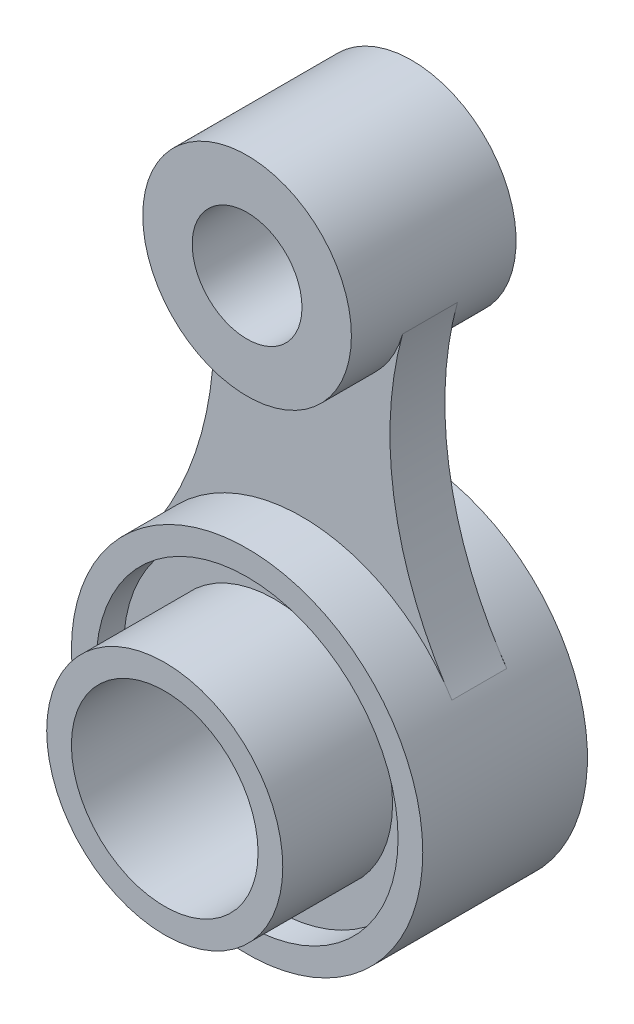
ISO-10303-21;
HEADER;
FILE_DESCRIPTION(('STEP AP214'),'2;1');
FILE_NAME('part.step','',(''),(''),'','','');
FILE_SCHEMA(('AUTOMOTIVE_DESIGN { 1 0 10303 214 1 1 1 1 }'));
ENDSEC;
DATA;
#1=APPLICATION_CONTEXT('core data for automotive mechanical design processes');
#2=APPLICATION_PROTOCOL_DEFINITION('international standard','automotive_design',2000,#1);
#3=PRODUCT_CONTEXT('',#1,'mechanical');
#4=PRODUCT('Part','Part','',(#3));
#5=PRODUCT_RELATED_PRODUCT_CATEGORY('part','',(#4));
#6=PRODUCT_DEFINITION_FORMATION('','',#4);
#7=PRODUCT_DEFINITION_CONTEXT('part definition',#1,'design');
#8=PRODUCT_DEFINITION('design','',#6,#7);
#9=PRODUCT_DEFINITION_SHAPE('','',#8);
#10=(LENGTH_UNIT() NAMED_UNIT(*) SI_UNIT(.MILLI.,.METRE.));
#11=(NAMED_UNIT(*) PLANE_ANGLE_UNIT() SI_UNIT($,.RADIAN.));
#12=(NAMED_UNIT(*) SI_UNIT($,.STERADIAN.) SOLID_ANGLE_UNIT());
#13=UNCERTAINTY_MEASURE_WITH_UNIT(LENGTH_MEASURE(1.E-05),#10,'distance_accuracy_value','');
#14=(GEOMETRIC_REPRESENTATION_CONTEXT(3) GLOBAL_UNCERTAINTY_ASSIGNED_CONTEXT((#13)) GLOBAL_UNIT_ASSIGNED_CONTEXT((#10,
#11,#12)) REPRESENTATION_CONTEXT('',''));
#15=CARTESIAN_POINT('',(0.,0.,0.));
#16=DIRECTION('',(0.,0.,1.));
#17=DIRECTION('',(1.,0.,0.));
#18=AXIS2_PLACEMENT_3D('',#15,#16,#17);
#19=CARTESIAN_POINT('',(0.,0.,10.));
#20=DIRECTION('',(0.,0.,1.));
#21=DIRECTION('',(1.,0.,0.));
#22=AXIS2_PLACEMENT_3D('',#19,#20,#21);
#23=PLANE('',#22);
#24=CARTESIAN_POINT('',(-80.0241332010139,-22.0258508445506,10.));
#25=DIRECTION('',(0.,0.,1.));
#26=DIRECTION('',(1.,0.,0.));
#27=AXIS2_PLACEMENT_3D('',#24,#25,#26);
#28=CIRCLE('',#27,64.);
#29=CARTESIAN_POINT('',(-18.3187774797502,-5.04206224152363,10.));
#30=VERTEX_POINT('',#29);
#31=CARTESIAN_POINT('',(-26.0353748344976,-56.3946443939598,10.));
#32=VERTEX_POINT('',#31);
#33=EDGE_CURVE('E113',#30,#32,#28,.F.);
#34=ORIENTED_EDGE('',*,*,#33,.T.);
#35=CARTESIAN_POINT('',(0.,-75.,10.));
#36=DIRECTION('',(0.,0.,1.));
#37=DIRECTION('',(1.,0.,0.));
#38=AXIS2_PLACEMENT_3D('',#35,#36,#37);
#39=CIRCLE('',#38,32.);
#40=CARTESIAN_POINT('',(26.0353748344976,-56.3946443939598,10.));
#41=VERTEX_POINT('',#40);
#42=EDGE_CURVE('E11',#32,#41,#39,.F.);
#43=ORIENTED_EDGE('',*,*,#42,.T.);
#44=CARTESIAN_POINT('',(80.0241332010139,-22.0258508445506,10.));
#45=DIRECTION('',(0.,0.,1.));
#46=DIRECTION('',(1.,0.,0.));
#47=AXIS2_PLACEMENT_3D('',#44,#45,#46);
#48=CIRCLE('',#47,64.);
#49=CARTESIAN_POINT('',(18.3187774797502,-5.04206224152362,10.));
#50=VERTEX_POINT('',#49);
#51=EDGE_CURVE('E104',#50,#41,#48,.T.);
#52=ORIENTED_EDGE('',*,*,#51,.F.);
#53=CARTESIAN_POINT('',(0.,0.,10.));
#54=DIRECTION('',(0.,0.,1.));
#55=DIRECTION('',(1.,0.,0.));
#56=AXIS2_PLACEMENT_3D('',#53,#54,#55);
#57=CIRCLE('',#56,19.);
#58=EDGE_CURVE('E131',#30,#50,#57,.T.);
#59=ORIENTED_EDGE('',*,*,#58,.F.);
#60=EDGE_LOOP('',(#34,#43,#52,#59));
#61=FACE_BOUND('',#60,.T.);
#62=ADVANCED_FACE('F37',(#61),#23,.T.);
#63=CARTESIAN_POINT('',(0.,0.,0.));
#64=DIRECTION('',(0.,0.,1.));
#65=DIRECTION('',(1.,0.,0.));
#66=AXIS2_PLACEMENT_3D('',#63,#64,#65);
#67=PLANE('',#66);
#68=CARTESIAN_POINT('',(0.,-75.,0.));
#69=DIRECTION('',(0.,0.,-1.));
#70=DIRECTION('',(-1.,0.,0.));
#71=AXIS2_PLACEMENT_3D('',#68,#69,#70);
#72=CIRCLE('',#71,32.);
#73=CARTESIAN_POINT('',(-26.0353748344974,-56.3946443939595,0.));
#74=VERTEX_POINT('',#73);
#75=CARTESIAN_POINT('',(26.0353748344974,-56.3946443939595,0.));
#76=VERTEX_POINT('',#75);
#77=EDGE_CURVE('E59',#74,#76,#72,.T.);
#78=ORIENTED_EDGE('',*,*,#77,.F.);
#79=CARTESIAN_POINT('',(-80.0241332010139,-22.0258508445506,0.));
#80=DIRECTION('',(0.,0.,1.));
#81=DIRECTION('',(1.,0.,0.));
#82=AXIS2_PLACEMENT_3D('',#79,#80,#81);
#83=CIRCLE('',#82,64.);
#84=CARTESIAN_POINT('',(-18.3187774797502,-5.04206224152363,0.));
#85=VERTEX_POINT('',#84);
#86=EDGE_CURVE('E105',#85,#74,#83,.F.);
#87=ORIENTED_EDGE('',*,*,#86,.F.);
#88=CARTESIAN_POINT('',(0.,0.,0.));
#89=DIRECTION('',(0.,0.,-1.));
#90=DIRECTION('',(-1.,0.,0.));
#91=AXIS2_PLACEMENT_3D('',#88,#89,#90);
#92=CIRCLE('',#91,19.);
#93=CARTESIAN_POINT('',(18.3187774797502,-5.04206224152362,0.));
#94=VERTEX_POINT('',#93);
#95=EDGE_CURVE('E130',#94,#85,#92,.T.);
#96=ORIENTED_EDGE('',*,*,#95,.F.);
#97=CARTESIAN_POINT('',(80.0241332010139,-22.0258508445506,0.));
#98=DIRECTION('',(0.,0.,1.));
#99=DIRECTION('',(1.,0.,0.));
#100=AXIS2_PLACEMENT_3D('',#97,#98,#99);
#101=CIRCLE('',#100,64.);
#102=EDGE_CURVE('E133',#94,#76,#101,.T.);
#103=ORIENTED_EDGE('',*,*,#102,.T.);
#104=EDGE_LOOP('',(#78,#87,#96,#103));
#105=FACE_BOUND('',#104,.T.);
#106=ADVANCED_FACE('F132',(#105),#67,.F.);
#107=CARTESIAN_POINT('',(80.0241332010139,-22.0258508445506,10.));
#108=DIRECTION('',(0.,0.,-1.));
#109=DIRECTION('',(-1.,0.,0.));
#110=AXIS2_PLACEMENT_3D('',#107,#108,#109);
#111=CYLINDRICAL_SURFACE('',#110,64.);
#112=ORIENTED_EDGE('',*,*,#102,.F.);
#113=DIRECTION('',(0.,0.,-1.));
#114=VECTOR('',#113,1.);
#115=CARTESIAN_POINT('',(18.3187774797502,-5.04206224152362,10.));
#116=LINE('',#115,#114);
#117=EDGE_CURVE('E45',#50,#94,#116,.T.);
#118=ORIENTED_EDGE('',*,*,#117,.F.);
#119=ORIENTED_EDGE('',*,*,#51,.T.);
#120=CARTESIAN_POINT('',(27.297024290787,-58.3005250121991,10.));
#121=VERTEX_POINT('',#120);
#122=EDGE_CURVE('E93',#41,#121,#48,.T.);
#123=ORIENTED_EDGE('',*,*,#122,.T.);
#124=DIRECTION('',(0.,0.,-1.));
#125=VECTOR('',#124,1.);
#126=CARTESIAN_POINT('',(27.297024290787,-58.3005250121991,10.));
#127=LINE('',#126,#125);
#128=CARTESIAN_POINT('',(27.297024290787,-58.3005250121991,0.));
#129=VERTEX_POINT('',#128);
#130=EDGE_CURVE('E101',#121,#129,#127,.T.);
#131=ORIENTED_EDGE('',*,*,#130,.T.);
#132=CARTESIAN_POINT('',(80.0241332010139,-22.0258508445506,0.));
#133=DIRECTION('',(0.,0.,-1.));
#134=DIRECTION('',(-1.,0.,0.));
#135=AXIS2_PLACEMENT_3D('',#132,#133,#134);
#136=CIRCLE('',#135,64.);
#137=EDGE_CURVE('E52',#129,#76,#136,.T.);
#138=ORIENTED_EDGE('',*,*,#137,.T.);
#139=EDGE_LOOP('',(#112,#118,#119,#123,#131,#138));
#140=FACE_BOUND('',#139,.T.);
#141=ADVANCED_FACE('F39',(#140),#111,.F.);
#142=CARTESIAN_POINT('',(0.,0.,10.));
#143=DIRECTION('',(0.,0.,-1.));
#144=DIRECTION('',(-1.,0.,0.));
#145=AXIS2_PLACEMENT_3D('',#142,#143,#144);
#146=CYLINDRICAL_SURFACE('',#145,19.);
#147=ORIENTED_EDGE('',*,*,#117,.T.);
#148=ORIENTED_EDGE('',*,*,#95,.T.);
#149=DIRECTION('',(0.,0.,-1.));
#150=VECTOR('',#149,1.);
#151=CARTESIAN_POINT('',(-18.3187774797502,-5.04206224152363,10.));
#152=LINE('',#151,#150);
#153=EDGE_CURVE('E115',#30,#85,#152,.T.);
#154=ORIENTED_EDGE('',*,*,#153,.F.);
#155=ORIENTED_EDGE('',*,*,#58,.T.);
#156=EDGE_LOOP('',(#147,#148,#154,#155));
#157=FACE_BOUND('',#156,.T.);
#158=CARTESIAN_POINT('',(0.,0.,-10.));
#159=DIRECTION('',(0.,0.,-1.));
#160=DIRECTION('',(-1.,0.,0.));
#161=AXIS2_PLACEMENT_3D('',#158,#159,#160);
#162=CIRCLE('',#161,19.);
#163=CARTESIAN_POINT('',(-19.,0.,-10.));
#164=VERTEX_POINT('',#163);
#165=EDGE_CURVE('E134',#164,#164,#162,.T.);
#166=ORIENTED_EDGE('',*,*,#165,.F.);
#167=EDGE_LOOP('',(#166));
#168=FACE_BOUND('',#167,.T.);
#169=CARTESIAN_POINT('',(0.,0.,20.));
#170=DIRECTION('',(0.,0.,1.));
#171=DIRECTION('',(1.,0.,0.));
#172=AXIS2_PLACEMENT_3D('',#169,#170,#171);
#173=CIRCLE('',#172,19.);
#174=CARTESIAN_POINT('',(19.,0.,20.));
#175=VERTEX_POINT('',#174);
#176=EDGE_CURVE('E156',#175,#175,#173,.T.);
#177=ORIENTED_EDGE('',*,*,#176,.F.);
#178=EDGE_LOOP('',(#177));
#179=FACE_BOUND('',#178,.T.);
#180=ADVANCED_FACE('F127',(#157,#168,#179),#146,.T.);
#181=CARTESIAN_POINT('',(-80.0241332010139,-22.0258508445506,10.));
#182=DIRECTION('',(0.,0.,-1.));
#183=DIRECTION('',(-1.,0.,0.));
#184=AXIS2_PLACEMENT_3D('',#181,#182,#183);
#185=CYLINDRICAL_SURFACE('',#184,64.);
#186=ORIENTED_EDGE('',*,*,#86,.T.);
#187=CARTESIAN_POINT('',(-80.0241332010139,-22.0258508445506,0.));
#188=DIRECTION('',(0.,0.,-1.));
#189=DIRECTION('',(-1.,0.,0.));
#190=AXIS2_PLACEMENT_3D('',#187,#188,#189);
#191=CIRCLE('',#190,64.);
#192=CARTESIAN_POINT('',(-27.2970242907871,-58.3005250121994,0.));
#193=VERTEX_POINT('',#192);
#194=EDGE_CURVE('E138',#193,#74,#191,.F.);
#195=ORIENTED_EDGE('',*,*,#194,.F.);
#196=DIRECTION('',(0.,0.,-1.));
#197=VECTOR('',#196,1.);
#198=CARTESIAN_POINT('',(-27.2970242907871,-58.3005250121994,10.));
#199=LINE('',#198,#197);
#200=CARTESIAN_POINT('',(-27.2970242907871,-58.3005250121994,10.));
#201=VERTEX_POINT('',#200);
#202=EDGE_CURVE('E112',#201,#193,#199,.T.);
#203=ORIENTED_EDGE('',*,*,#202,.F.);
#204=EDGE_CURVE('E118',#32,#201,#28,.F.);
#205=ORIENTED_EDGE('',*,*,#204,.F.);
#206=ORIENTED_EDGE('',*,*,#33,.F.);
#207=ORIENTED_EDGE('',*,*,#153,.T.);
#208=EDGE_LOOP('',(#186,#195,#203,#205,#206,#207));
#209=FACE_BOUND('',#208,.T.);
#210=ADVANCED_FACE('F143',(#209),#185,.F.);
#211=CARTESIAN_POINT('',(0.,-75.,10.));
#212=DIRECTION('',(0.,0.,-1.));
#213=DIRECTION('',(-1.,0.,0.));
#214=AXIS2_PLACEMENT_3D('',#211,#212,#213);
#215=CYLINDRICAL_SURFACE('',#214,32.);
#216=ORIENTED_EDGE('',*,*,#202,.T.);
#217=EDGE_CURVE('E150',#193,#74,#72,.T.);
#218=ORIENTED_EDGE('',*,*,#217,.T.);
#219=ORIENTED_EDGE('',*,*,#77,.T.);
#220=EDGE_CURVE('E111',#76,#129,#72,.T.);
#221=ORIENTED_EDGE('',*,*,#220,.T.);
#222=ORIENTED_EDGE('',*,*,#130,.F.);
#223=CARTESIAN_POINT('',(0.,-75.,10.));
#224=DIRECTION('',(0.,0.,1.));
#225=DIRECTION('',(1.,0.,0.));
#226=AXIS2_PLACEMENT_3D('',#223,#224,#225);
#227=CIRCLE('',#226,32.);
#228=EDGE_CURVE('E90',#121,#41,#227,.T.);
#229=ORIENTED_EDGE('',*,*,#228,.T.);
#230=ORIENTED_EDGE('',*,*,#42,.F.);
#231=EDGE_CURVE('E98',#32,#201,#227,.T.);
#232=ORIENTED_EDGE('',*,*,#231,.T.);
#233=EDGE_LOOP('',(#216,#218,#219,#221,#222,#229,#230,#232));
#234=FACE_BOUND('',#233,.T.);
#235=CARTESIAN_POINT('',(0.,-75.,-10.));
#236=DIRECTION('',(0.,0.,-1.));
#237=DIRECTION('',(-1.,0.,0.));
#238=AXIS2_PLACEMENT_3D('',#235,#236,#237);
#239=CIRCLE('',#238,32.);
#240=CARTESIAN_POINT('',(-32.,-75.,-10.));
#241=VERTEX_POINT('',#240);
#242=EDGE_CURVE('E151',#241,#241,#239,.T.);
#243=ORIENTED_EDGE('',*,*,#242,.F.);
#244=EDGE_LOOP('',(#243));
#245=FACE_BOUND('',#244,.T.);
#246=CARTESIAN_POINT('',(0.,-75.,20.));
#247=DIRECTION('',(0.,0.,1.));
#248=DIRECTION('',(1.,0.,0.));
#249=AXIS2_PLACEMENT_3D('',#246,#247,#248);
#250=CIRCLE('',#249,32.);
#251=CARTESIAN_POINT('',(32.,-75.,20.));
#252=VERTEX_POINT('',#251);
#253=EDGE_CURVE('E97',#252,#252,#250,.T.);
#254=ORIENTED_EDGE('',*,*,#253,.F.);
#255=EDGE_LOOP('',(#254));
#256=FACE_BOUND('',#255,.T.);
#257=ADVANCED_FACE('F108',(#234,#245,#256),#215,.T.);
#258=CARTESIAN_POINT('',(0.,0.,-10.));
#259=DIRECTION('',(0.,0.,-1.));
#260=DIRECTION('',(-1.,0.,0.));
#261=AXIS2_PLACEMENT_3D('',#258,#259,#260);
#262=PLANE('',#261);
#263=CARTESIAN_POINT('',(0.,0.,-10.));
#264=DIRECTION('',(0.,0.,-1.));
#265=DIRECTION('',(-1.,0.,0.));
#266=AXIS2_PLACEMENT_3D('',#263,#264,#265);
#267=CIRCLE('',#266,10.);
#268=CARTESIAN_POINT('',(10.,0.,-10.));
#269=VERTEX_POINT('',#268);
#270=EDGE_CURVE('E181',#269,#269,#267,.T.);
#271=ORIENTED_EDGE('',*,*,#270,.F.);
#272=EDGE_LOOP('',(#271));
#273=FACE_BOUND('',#272,.T.);
#274=ORIENTED_EDGE('',*,*,#165,.T.);
#275=EDGE_LOOP('',(#274));
#276=FACE_BOUND('',#275,.T.);
#277=ADVANCED_FACE('F216',(#273,#276),#262,.T.);
#278=CARTESIAN_POINT('',(0.,-75.,0.));
#279=DIRECTION('',(0.,0.,-1.));
#280=DIRECTION('',(-1.,0.,0.));
#281=AXIS2_PLACEMENT_3D('',#278,#279,#280);
#282=PLANE('',#281);
#283=ORIENTED_EDGE('',*,*,#217,.F.);
#284=ORIENTED_EDGE('',*,*,#194,.T.);
#285=EDGE_LOOP('',(#283,#284));
#286=FACE_BOUND('',#285,.T.);
#287=ADVANCED_FACE('F149',(#286),#282,.F.);
#288=CARTESIAN_POINT('',(0.,-75.,-10.));
#289=DIRECTION('',(0.,0.,-1.));
#290=DIRECTION('',(-1.,0.,0.));
#291=AXIS2_PLACEMENT_3D('',#288,#289,#290);
#292=PLANE('',#291);
#293=CARTESIAN_POINT('',(0.,-75.,-9.99999999999999));
#294=DIRECTION('',(0.,0.,1.));
#295=DIRECTION('',(1.,0.,0.));
#296=AXIS2_PLACEMENT_3D('',#293,#294,#295);
#297=CIRCLE('',#296,17.);
#298=CARTESIAN_POINT('',(17.,-75.,-10.));
#299=VERTEX_POINT('',#298);
#300=EDGE_CURVE('E175',#299,#299,#297,.T.);
#301=ORIENTED_EDGE('',*,*,#300,.T.);
#302=EDGE_LOOP('',(#301));
#303=FACE_BOUND('',#302,.T.);
#304=ORIENTED_EDGE('',*,*,#242,.T.);
#305=EDGE_LOOP('',(#304));
#306=FACE_BOUND('',#305,.T.);
#307=ADVANCED_FACE('F204',(#303,#306),#292,.T.);
#308=ORIENTED_EDGE('',*,*,#137,.F.);
#309=ORIENTED_EDGE('',*,*,#220,.F.);
#310=EDGE_LOOP('',(#308,#309));
#311=FACE_BOUND('',#310,.T.);
#312=ADVANCED_FACE('F195',(#311),#282,.F.);
#313=CARTESIAN_POINT('',(0.,0.,20.));
#314=DIRECTION('',(0.,0.,1.));
#315=DIRECTION('',(1.,0.,0.));
#316=AXIS2_PLACEMENT_3D('',#313,#314,#315);
#317=PLANE('',#316);
#318=CARTESIAN_POINT('',(0.,0.,20.));
#319=DIRECTION('',(0.,0.,1.));
#320=DIRECTION('',(1.,0.,0.));
#321=AXIS2_PLACEMENT_3D('',#318,#319,#320);
#322=CIRCLE('',#321,10.);
#323=CARTESIAN_POINT('',(10.,0.,20.));
#324=VERTEX_POINT('',#323);
#325=EDGE_CURVE('E186',#324,#324,#322,.T.);
#326=ORIENTED_EDGE('',*,*,#325,.F.);
#327=EDGE_LOOP('',(#326));
#328=FACE_BOUND('',#327,.T.);
#329=ORIENTED_EDGE('',*,*,#176,.T.);
#330=EDGE_LOOP('',(#329));
#331=FACE_BOUND('',#330,.T.);
#332=ADVANCED_FACE('F192',(#328,#331),#317,.T.);
#333=CARTESIAN_POINT('',(0.,-75.,10.));
#334=DIRECTION('',(0.,0.,1.));
#335=DIRECTION('',(1.,0.,0.));
#336=AXIS2_PLACEMENT_3D('',#333,#334,#335);
#337=PLANE('',#336);
#338=ORIENTED_EDGE('',*,*,#231,.F.);
#339=ORIENTED_EDGE('',*,*,#204,.T.);
#340=EDGE_LOOP('',(#338,#339));
#341=FACE_BOUND('',#340,.T.);
#342=ADVANCED_FACE('F194',(#341),#337,.F.);
#343=CARTESIAN_POINT('',(0.,-75.,20.));
#344=DIRECTION('',(0.,0.,1.));
#345=DIRECTION('',(1.,0.,0.));
#346=AXIS2_PLACEMENT_3D('',#343,#344,#345);
#347=PLANE('',#346);
#348=CARTESIAN_POINT('',(0.,-75.,20.));
#349=DIRECTION('',(0.,0.,1.));
#350=DIRECTION('',(1.,0.,0.));
#351=AXIS2_PLACEMENT_3D('',#348,#349,#350);
#352=CIRCLE('',#351,27.5);
#353=CARTESIAN_POINT('',(27.5,-75.,20.));
#354=VERTEX_POINT('',#353);
#355=EDGE_CURVE('E165',#354,#354,#352,.T.);
#356=ORIENTED_EDGE('',*,*,#355,.F.);
#357=EDGE_LOOP('',(#356));
#358=FACE_BOUND('',#357,.T.);
#359=ORIENTED_EDGE('',*,*,#253,.T.);
#360=EDGE_LOOP('',(#359));
#361=FACE_BOUND('',#360,.T.);
#362=ADVANCED_FACE('F201',(#358,#361),#347,.T.);
#363=ORIENTED_EDGE('',*,*,#122,.F.);
#364=ORIENTED_EDGE('',*,*,#228,.F.);
#365=EDGE_LOOP('',(#363,#364));
#366=FACE_BOUND('',#365,.T.);
#367=ADVANCED_FACE('F92',(#366),#337,.F.);
#368=CARTESIAN_POINT('',(0.,-75.,15.));
#369=DIRECTION('',(0.,0.,1.));
#370=DIRECTION('',(1.,0.,0.));
#371=AXIS2_PLACEMENT_3D('',#368,#369,#370);
#372=CYLINDRICAL_SURFACE('',#371,27.5);
#373=CARTESIAN_POINT('',(0.,-75.,15.));
#374=DIRECTION('',(0.,0.,1.));
#375=DIRECTION('',(1.,0.,0.));
#376=AXIS2_PLACEMENT_3D('',#373,#374,#375);
#377=CIRCLE('',#376,27.5);
#378=CARTESIAN_POINT('',(27.5,-75.,15.));
#379=VERTEX_POINT('',#378);
#380=EDGE_CURVE('E168',#379,#379,#377,.T.);
#381=ORIENTED_EDGE('',*,*,#380,.F.);
#382=EDGE_LOOP('',(#381));
#383=FACE_BOUND('',#382,.T.);
#384=ORIENTED_EDGE('',*,*,#355,.T.);
#385=EDGE_LOOP('',(#384));
#386=FACE_BOUND('',#385,.T.);
#387=ADVANCED_FACE('F297',(#383,#386),#372,.F.);
#388=CARTESIAN_POINT('',(0.,-75.,15.));
#389=DIRECTION('',(0.,0.,1.));
#390=DIRECTION('',(1.,0.,0.));
#391=AXIS2_PLACEMENT_3D('',#388,#389,#390);
#392=PLANE('',#391);
#393=CARTESIAN_POINT('',(0.,-75.,15.));
#394=DIRECTION('',(0.,0.,1.));
#395=DIRECTION('',(1.,0.,0.));
#396=AXIS2_PLACEMENT_3D('',#393,#394,#395);
#397=CIRCLE('',#396,21.5);
#398=CARTESIAN_POINT('',(21.5,-75.,15.));
#399=VERTEX_POINT('',#398);
#400=EDGE_CURVE('E172',#399,#399,#397,.T.);
#401=ORIENTED_EDGE('',*,*,#400,.F.);
#402=EDGE_LOOP('',(#401));
#403=FACE_BOUND('',#402,.T.);
#404=ORIENTED_EDGE('',*,*,#380,.T.);
#405=EDGE_LOOP('',(#404));
#406=FACE_BOUND('',#405,.T.);
#407=ADVANCED_FACE('F264',(#403,#406),#392,.T.);
#408=CARTESIAN_POINT('',(0.,-75.,35.));
#409=DIRECTION('',(0.,0.,-1.));
#410=DIRECTION('',(-1.,0.,0.));
#411=AXIS2_PLACEMENT_3D('',#408,#409,#410);
#412=CYLINDRICAL_SURFACE('',#411,21.5);
#413=CARTESIAN_POINT('',(0.,-75.,35.));
#414=DIRECTION('',(0.,0.,1.));
#415=DIRECTION('',(1.,0.,0.));
#416=AXIS2_PLACEMENT_3D('',#413,#414,#415);
#417=CIRCLE('',#416,21.5);
#418=CARTESIAN_POINT('',(21.5,-75.,35.));
#419=VERTEX_POINT('',#418);
#420=EDGE_CURVE('E169',#419,#419,#417,.T.);
#421=ORIENTED_EDGE('',*,*,#420,.F.);
#422=EDGE_LOOP('',(#421));
#423=FACE_BOUND('',#422,.T.);
#424=ORIENTED_EDGE('',*,*,#400,.T.);
#425=EDGE_LOOP('',(#424));
#426=FACE_BOUND('',#425,.T.);
#427=ADVANCED_FACE('F258',(#423,#426),#412,.T.);
#428=CARTESIAN_POINT('',(0.,-75.,35.));
#429=DIRECTION('',(0.,0.,1.));
#430=DIRECTION('',(1.,0.,0.));
#431=AXIS2_PLACEMENT_3D('',#428,#429,#430);
#432=PLANE('',#431);
#433=CARTESIAN_POINT('',(0.,-75.,35.));
#434=DIRECTION('',(0.,0.,1.));
#435=DIRECTION('',(1.,0.,0.));
#436=AXIS2_PLACEMENT_3D('',#433,#434,#435);
#437=CIRCLE('',#436,17.);
#438=CARTESIAN_POINT('',(17.,-75.,35.));
#439=VERTEX_POINT('',#438);
#440=EDGE_CURVE('E178',#439,#439,#437,.T.);
#441=ORIENTED_EDGE('',*,*,#440,.F.);
#442=EDGE_LOOP('',(#441));
#443=FACE_BOUND('',#442,.T.);
#444=ORIENTED_EDGE('',*,*,#420,.T.);
#445=EDGE_LOOP('',(#444));
#446=FACE_BOUND('',#445,.T.);
#447=ADVANCED_FACE('F263',(#443,#446),#432,.T.);
#448=CARTESIAN_POINT('',(0.,-75.,-9.99999999999999));
#449=DIRECTION('',(0.,0.,1.));
#450=DIRECTION('',(1.,0.,0.));
#451=AXIS2_PLACEMENT_3D('',#448,#449,#450);
#452=CYLINDRICAL_SURFACE('',#451,17.);
#453=CARTESIAN_POINT('',(17.,-75.,-10.));
#454=CARTESIAN_POINT('',(17.,-75.,-9.53125));
#455=CARTESIAN_POINT('',(17.,-75.,-9.0625));
#456=CARTESIAN_POINT('',(17.,-75.,-8.12499999999999));
#457=CARTESIAN_POINT('',(17.,-75.,-7.65625));
#458=CARTESIAN_POINT('',(17.,-75.,-6.71875));
#459=CARTESIAN_POINT('',(17.,-75.,-6.25));
#460=CARTESIAN_POINT('',(17.,-75.,-5.3125));
#461=CARTESIAN_POINT('',(17.,-75.,-4.84375));
#462=CARTESIAN_POINT('',(17.,-75.,-3.90625));
#463=CARTESIAN_POINT('',(17.,-75.,-3.4375));
#464=CARTESIAN_POINT('',(17.,-75.,-2.5));
#465=CARTESIAN_POINT('',(17.,-75.,-2.03125));
#466=CARTESIAN_POINT('',(17.,-75.,-1.09375));
#467=CARTESIAN_POINT('',(17.,-75.,-0.624999999999998));
#468=CARTESIAN_POINT('',(17.,-75.,0.312500000000001));
#469=CARTESIAN_POINT('',(17.,-75.,0.781250000000001));
#470=CARTESIAN_POINT('',(17.,-75.,1.71875));
#471=CARTESIAN_POINT('',(17.,-75.,2.1875));
#472=CARTESIAN_POINT('',(17.,-75.,3.125));
#473=CARTESIAN_POINT('',(17.,-75.,3.59375));
#474=CARTESIAN_POINT('',(17.,-75.,4.53125));
#475=CARTESIAN_POINT('',(17.,-75.,5.));
#476=CARTESIAN_POINT('',(17.,-75.,5.9375));
#477=CARTESIAN_POINT('',(17.,-75.,6.40625));
#478=CARTESIAN_POINT('',(17.,-75.,7.34375));
#479=CARTESIAN_POINT('',(17.,-75.,7.8125));
#480=CARTESIAN_POINT('',(17.,-75.,8.75));
#481=CARTESIAN_POINT('',(17.,-75.,9.21875));
#482=CARTESIAN_POINT('',(17.,-75.,10.15625));
#483=CARTESIAN_POINT('',(17.,-75.,10.625));
#484=CARTESIAN_POINT('',(17.,-75.,11.5625));
#485=CARTESIAN_POINT('',(17.,-75.,12.03125));
#486=CARTESIAN_POINT('',(17.,-75.,12.96875));
#487=CARTESIAN_POINT('',(17.,-75.,13.4375));
#488=CARTESIAN_POINT('',(17.,-75.,14.375));
#489=CARTESIAN_POINT('',(17.,-75.,14.84375));
#490=CARTESIAN_POINT('',(17.,-75.,15.78125));
#491=CARTESIAN_POINT('',(17.,-75.,16.25));
#492=CARTESIAN_POINT('',(17.,-75.,17.1875));
#493=CARTESIAN_POINT('',(17.,-75.,17.65625));
#494=CARTESIAN_POINT('',(17.,-75.,18.59375));
#495=CARTESIAN_POINT('',(17.,-75.,19.0625));
#496=CARTESIAN_POINT('',(17.,-75.,20.));
#497=CARTESIAN_POINT('',(17.,-75.,20.46875));
#498=CARTESIAN_POINT('',(17.,-75.,21.40625));
#499=CARTESIAN_POINT('',(17.,-75.,21.875));
#500=CARTESIAN_POINT('',(17.,-75.,22.8125));
#501=CARTESIAN_POINT('',(17.,-75.,23.28125));
#502=CARTESIAN_POINT('',(17.,-75.,24.21875));
#503=CARTESIAN_POINT('',(17.,-75.,24.6875));
#504=CARTESIAN_POINT('',(17.,-75.,25.625));
#505=CARTESIAN_POINT('',(17.,-75.,26.09375));
#506=CARTESIAN_POINT('',(17.,-75.,27.03125));
#507=CARTESIAN_POINT('',(17.,-75.,27.5));
#508=CARTESIAN_POINT('',(17.,-75.,28.4375));
#509=CARTESIAN_POINT('',(17.,-75.,28.90625));
#510=CARTESIAN_POINT('',(17.,-75.,29.84375));
#511=CARTESIAN_POINT('',(17.,-75.,30.3125));
#512=CARTESIAN_POINT('',(17.,-75.,31.25));
#513=CARTESIAN_POINT('',(17.,-75.,31.71875));
#514=CARTESIAN_POINT('',(17.,-75.,32.65625));
#515=CARTESIAN_POINT('',(17.,-75.,33.125));
#516=CARTESIAN_POINT('',(17.,-75.,34.0625));
#517=CARTESIAN_POINT('',(17.,-75.,34.53125));
#518=CARTESIAN_POINT('',(17.,-75.,35.));
#519=B_SPLINE_CURVE_WITH_KNOTS('',3,(#453,#454,#455,#456,#457,#458,#459,#460,#461,#462,#463,
#464,#465,#466,#467,#468,#469,#470,#471,#472,#473,#474,#475,#476,#477,#478,#479,#480,#481,#482,
#483,#484,#485,#486,#487,#488,#489,#490,#491,#492,#493,#494,#495,#496,#497,#498,#499,#500,#501,
#502,#503,#504,#505,#506,#507,#508,#509,#510,#511,#512,#513,#514,#515,#516,#517,#518),
.UNSPECIFIED.,.F.,.F.,(4,2,2,2,2,2,2,2,2,2,2,2,2,2,2,2,2,2,2,2,2,2,2,2,2,2,2,2,2,2,2,2,4),(0.,
1.40625,2.8125,4.21875,5.625,7.03125,8.4375,9.84375,11.25,12.65625,14.0625,15.46875,16.875,
18.28125,19.6875,21.09375,22.5,23.90625,25.3125,26.71875,28.125,29.53125,30.9375,32.34375,33.75,
35.15625,36.5625,37.96875,39.375,40.78125,42.1875,43.59375,45.),.UNSPECIFIED.);
#520=EDGE_CURVE('BSEAM277',#299,#439,#519,.T.);
#521=ORIENTED_EDGE('',*,*,#300,.F.);
#522=ORIENTED_EDGE('',*,*,#440,.T.);
#523=ORIENTED_EDGE('',*,*,#520,.T.);
#524=ORIENTED_EDGE('',*,*,#520,.F.);
#525=EDGE_LOOP('',(#521,#523,#522,#524));
#526=FACE_BOUND('',#525,.T.);
#527=ADVANCED_FACE('F277',(#526),#452,.F.);
#528=CARTESIAN_POINT('',(0.,0.,-25.));
#529=DIRECTION('',(0.,0.,1.));
#530=DIRECTION('',(1.,0.,0.));
#531=AXIS2_PLACEMENT_3D('',#528,#529,#530);
#532=CYLINDRICAL_SURFACE('',#531,10.);
#533=CARTESIAN_POINT('',(10.,0.,-10.));
#534=CARTESIAN_POINT('',(10.,0.,-9.6875));
#535=CARTESIAN_POINT('',(10.,0.,-9.375));
#536=CARTESIAN_POINT('',(10.,0.,-8.75));
#537=CARTESIAN_POINT('',(10.,0.,-8.4375));
#538=CARTESIAN_POINT('',(10.,0.,-7.8125));
#539=CARTESIAN_POINT('',(10.,0.,-7.5));
#540=CARTESIAN_POINT('',(10.,0.,-6.875));
#541=CARTESIAN_POINT('',(10.,0.,-6.5625));
#542=CARTESIAN_POINT('',(10.,0.,-5.9375));
#543=CARTESIAN_POINT('',(10.,0.,-5.625));
#544=CARTESIAN_POINT('',(10.,0.,-5.));
#545=CARTESIAN_POINT('',(10.,0.,-4.6875));
#546=CARTESIAN_POINT('',(10.,0.,-4.0625));
#547=CARTESIAN_POINT('',(10.,0.,-3.75));
#548=CARTESIAN_POINT('',(10.,0.,-3.125));
#549=CARTESIAN_POINT('',(10.,0.,-2.8125));
#550=CARTESIAN_POINT('',(10.,0.,-2.1875));
#551=CARTESIAN_POINT('',(10.,0.,-1.875));
#552=CARTESIAN_POINT('',(10.,0.,-1.25));
#553=CARTESIAN_POINT('',(10.,0.,-0.937500000000001));
#554=CARTESIAN_POINT('',(10.,0.,-0.312500000000001));
#555=CARTESIAN_POINT('',(10.,0.,0.));
#556=CARTESIAN_POINT('',(10.,0.,0.624999999999997));
#557=CARTESIAN_POINT('',(10.,0.,0.937499999999997));
#558=CARTESIAN_POINT('',(10.,0.,1.5625));
#559=CARTESIAN_POINT('',(10.,0.,1.875));
#560=CARTESIAN_POINT('',(10.,0.,2.5));
#561=CARTESIAN_POINT('',(10.,0.,2.8125));
#562=CARTESIAN_POINT('',(10.,0.,3.4375));
#563=CARTESIAN_POINT('',(10.,0.,3.75));
#564=CARTESIAN_POINT('',(10.,0.,4.375));
#565=CARTESIAN_POINT('',(10.,0.,4.6875));
#566=CARTESIAN_POINT('',(10.,0.,5.3125));
#567=CARTESIAN_POINT('',(10.,0.,5.625));
#568=CARTESIAN_POINT('',(10.,0.,6.25));
#569=CARTESIAN_POINT('',(10.,0.,6.5625));
#570=CARTESIAN_POINT('',(10.,0.,7.18749999999999));
#571=CARTESIAN_POINT('',(10.,0.,7.49999999999999));
#572=CARTESIAN_POINT('',(10.,0.,8.12499999999999));
#573=CARTESIAN_POINT('',(10.,0.,8.43749999999999));
#574=CARTESIAN_POINT('',(10.,0.,9.0625));
#575=CARTESIAN_POINT('',(10.,0.,9.37499999999999));
#576=CARTESIAN_POINT('',(10.,0.,9.99999999999999));
#577=CARTESIAN_POINT('',(10.,0.,10.3125));
#578=CARTESIAN_POINT('',(10.,0.,10.9375));
#579=CARTESIAN_POINT('',(10.,0.,11.25));
#580=CARTESIAN_POINT('',(10.,0.,11.875));
#581=CARTESIAN_POINT('',(10.,0.,12.1875));
#582=CARTESIAN_POINT('',(10.,0.,12.8125));
#583=CARTESIAN_POINT('',(10.,0.,13.125));
#584=CARTESIAN_POINT('',(10.,0.,13.75));
#585=CARTESIAN_POINT('',(10.,0.,14.0625));
#586=CARTESIAN_POINT('',(10.,0.,14.6875));
#587=CARTESIAN_POINT('',(10.,0.,15.));
#588=CARTESIAN_POINT('',(10.,0.,15.625));
#589=CARTESIAN_POINT('',(10.,0.,15.9375));
#590=CARTESIAN_POINT('',(10.,0.,16.5625));
#591=CARTESIAN_POINT('',(10.,0.,16.875));
#592=CARTESIAN_POINT('',(10.,0.,17.5));
#593=CARTESIAN_POINT('',(10.,0.,17.8125));
#594=CARTESIAN_POINT('',(10.,0.,18.4375));
#595=CARTESIAN_POINT('',(10.,0.,18.75));
#596=CARTESIAN_POINT('',(10.,0.,19.375));
#597=CARTESIAN_POINT('',(10.,0.,19.6875));
#598=CARTESIAN_POINT('',(10.,0.,20.));
#599=B_SPLINE_CURVE_WITH_KNOTS('',3,(#533,#534,#535,#536,#537,#538,#539,#540,#541,#542,#543,
#544,#545,#546,#547,#548,#549,#550,#551,#552,#553,#554,#555,#556,#557,#558,#559,#560,#561,#562,
#563,#564,#565,#566,#567,#568,#569,#570,#571,#572,#573,#574,#575,#576,#577,#578,#579,#580,#581,
#582,#583,#584,#585,#586,#587,#588,#589,#590,#591,#592,#593,#594,#595,#596,#597,#598),
.UNSPECIFIED.,.F.,.F.,(4,2,2,2,2,2,2,2,2,2,2,2,2,2,2,2,2,2,2,2,2,2,2,2,2,2,2,2,2,2,2,2,4),(0.,
0.937499999999999,1.875,2.8125,3.75,4.6875,5.625,6.5625,7.5,8.4375,9.375,10.3125,11.25,12.1875,
13.125,14.0625,15.,15.9375,16.875,17.8125,18.75,19.6875,20.625,21.5625,22.5,23.4375,24.375,
25.3125,26.25,27.1875,28.125,29.0625,30.),.UNSPECIFIED.);
#600=EDGE_CURVE('BSEAM190',#269,#324,#599,.T.);
#601=ORIENTED_EDGE('',*,*,#270,.T.);
#602=ORIENTED_EDGE('',*,*,#325,.T.);
#603=ORIENTED_EDGE('',*,*,#600,.T.);
#604=ORIENTED_EDGE('',*,*,#600,.F.);
#605=EDGE_LOOP('',(#601,#603,#602,#604));
#606=FACE_BOUND('',#605,.T.);
#607=ADVANCED_FACE('F190',(#606),#532,.F.);
#608=CLOSED_SHELL('',(#62,#106,#141,#180,#210,#257,#277,#287,#307,#312,#332,#342,#362,#367,#387,
#407,#427,#447,#527,#607));
#609=MANIFOLD_SOLID_BREP('B2',#608);
#610=ADVANCED_BREP_SHAPE_REPRESENTATION('',(#18,#609),#14);
#611=SHAPE_DEFINITION_REPRESENTATION(#9,#610);
ENDSEC;
END-ISO-10303-21;
